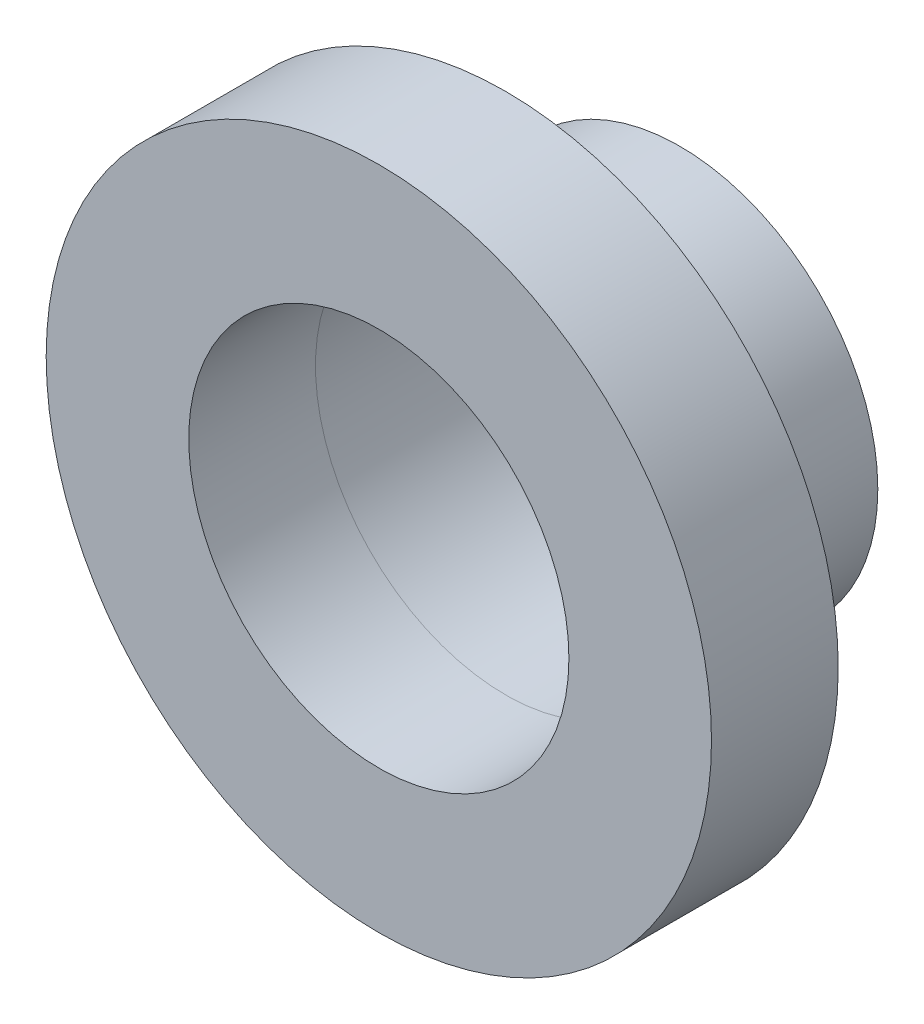
ISO-10303-21;
HEADER;
FILE_DESCRIPTION(('STEP AP214'),'2;1');
FILE_NAME('part.step','',(''),(''),'','','');
FILE_SCHEMA(('AUTOMOTIVE_DESIGN { 1 0 10303 214 1 1 1 1 }'));
ENDSEC;
DATA;
#1=APPLICATION_CONTEXT('core data for automotive mechanical design processes');
#2=APPLICATION_PROTOCOL_DEFINITION('international standard','automotive_design',2000,#1);
#3=PRODUCT_CONTEXT('',#1,'mechanical');
#4=PRODUCT('Part','Part','',(#3));
#5=PRODUCT_RELATED_PRODUCT_CATEGORY('part','',(#4));
#6=PRODUCT_DEFINITION_FORMATION('','',#4);
#7=PRODUCT_DEFINITION_CONTEXT('part definition',#1,'design');
#8=PRODUCT_DEFINITION('design','',#6,#7);
#9=PRODUCT_DEFINITION_SHAPE('','',#8);
#10=(LENGTH_UNIT() NAMED_UNIT(*) SI_UNIT(.MILLI.,.METRE.));
#11=(NAMED_UNIT(*) PLANE_ANGLE_UNIT() SI_UNIT($,.RADIAN.));
#12=(NAMED_UNIT(*) SI_UNIT($,.STERADIAN.) SOLID_ANGLE_UNIT());
#13=UNCERTAINTY_MEASURE_WITH_UNIT(LENGTH_MEASURE(1.E-05),#10,'distance_accuracy_value','');
#14=(GEOMETRIC_REPRESENTATION_CONTEXT(3) GLOBAL_UNCERTAINTY_ASSIGNED_CONTEXT((#13)) GLOBAL_UNIT_ASSIGNED_CONTEXT((#10,
#11,#12)) REPRESENTATION_CONTEXT('',''));
#15=CARTESIAN_POINT('',(0.,0.,0.));
#16=DIRECTION('',(0.,0.,1.));
#17=DIRECTION('',(1.,0.,0.));
#18=AXIS2_PLACEMENT_3D('',#15,#16,#17);
#19=CARTESIAN_POINT('',(0.,0.,19.));
#20=DIRECTION('',(0.,0.,1.));
#21=DIRECTION('',(1.,0.,0.));
#22=AXIS2_PLACEMENT_3D('',#19,#20,#21);
#23=PLANE('',#22);
#24=CARTESIAN_POINT('',(0.,0.,19.));
#25=DIRECTION('',(0.,0.,1.));
#26=DIRECTION('',(1.,0.,0.));
#27=AXIS2_PLACEMENT_3D('',#24,#25,#26);
#28=CIRCLE('',#27,21.);
#29=CARTESIAN_POINT('',(21.,0.,19.));
#30=VERTEX_POINT('',#29);
#31=EDGE_CURVE('E11',#30,#30,#28,.T.);
#32=ORIENTED_EDGE('',*,*,#31,.T.);
#33=EDGE_LOOP('',(#32));
#34=FACE_BOUND('',#33,.T.);
#35=CARTESIAN_POINT('',(0.,0.,19.));
#36=DIRECTION('',(0.,0.,1.));
#37=DIRECTION('',(1.,0.,0.));
#38=AXIS2_PLACEMENT_3D('',#35,#36,#37);
#39=CIRCLE('',#38,12.);
#40=CARTESIAN_POINT('',(12.,0.,19.));
#41=VERTEX_POINT('',#40);
#42=EDGE_CURVE('E50',#41,#41,#39,.T.);
#43=ORIENTED_EDGE('',*,*,#42,.F.);
#44=EDGE_LOOP('',(#43));
#45=FACE_BOUND('',#44,.T.);
#46=ADVANCED_FACE('F39',(#34,#45),#23,.T.);
#47=CARTESIAN_POINT('',(0.,0.,11.));
#48=DIRECTION('',(0.,0.,1.));
#49=DIRECTION('',(1.,0.,0.));
#50=AXIS2_PLACEMENT_3D('',#47,#48,#49);
#51=PLANE('',#50);
#52=CARTESIAN_POINT('',(0.,0.,11.));
#53=DIRECTION('',(0.,0.,1.));
#54=DIRECTION('',(1.,0.,0.));
#55=AXIS2_PLACEMENT_3D('',#52,#53,#54);
#56=CIRCLE('',#55,21.);
#57=CARTESIAN_POINT('',(21.,0.,11.));
#58=VERTEX_POINT('',#57);
#59=EDGE_CURVE('E43',#58,#58,#56,.T.);
#60=ORIENTED_EDGE('',*,*,#59,.F.);
#61=EDGE_LOOP('',(#60));
#62=FACE_BOUND('',#61,.T.);
#63=CARTESIAN_POINT('',(0.,0.,11.));
#64=DIRECTION('',(0.,0.,1.));
#65=DIRECTION('',(1.,0.,0.));
#66=AXIS2_PLACEMENT_3D('',#63,#64,#65);
#67=CIRCLE('',#66,12.);
#68=CARTESIAN_POINT('',(12.,0.,11.));
#69=VERTEX_POINT('',#68);
#70=EDGE_CURVE('E52',#69,#69,#67,.T.);
#71=ORIENTED_EDGE('',*,*,#70,.T.);
#72=EDGE_LOOP('',(#71));
#73=FACE_BOUND('',#72,.T.);
#74=ADVANCED_FACE('F62',(#62,#73),#51,.F.);
#75=CARTESIAN_POINT('',(0.,0.,19.));
#76=DIRECTION('',(0.,0.,-1.));
#77=DIRECTION('',(-1.,0.,0.));
#78=AXIS2_PLACEMENT_3D('',#75,#76,#77);
#79=CYLINDRICAL_SURFACE('',#78,21.);
#80=ORIENTED_EDGE('',*,*,#31,.F.);
#81=EDGE_LOOP('',(#80));
#82=FACE_BOUND('',#81,.T.);
#83=ORIENTED_EDGE('',*,*,#59,.T.);
#84=EDGE_LOOP('',(#83));
#85=FACE_BOUND('',#84,.T.);
#86=ADVANCED_FACE('F41',(#82,#85),#79,.T.);
#87=CARTESIAN_POINT('',(0.,0.,19.));
#88=DIRECTION('',(0.,0.,-1.));
#89=DIRECTION('',(-1.,0.,0.));
#90=AXIS2_PLACEMENT_3D('',#87,#88,#89);
#91=CYLINDRICAL_SURFACE('',#90,12.);
#92=ORIENTED_EDGE('',*,*,#42,.T.);
#93=EDGE_LOOP('',(#92));
#94=FACE_BOUND('',#93,.T.);
#95=ORIENTED_EDGE('',*,*,#70,.F.);
#96=EDGE_LOOP('',(#95));
#97=FACE_BOUND('',#96,.T.);
#98=ADVANCED_FACE('F58',(#94,#97),#91,.F.);
#99=CLOSED_SHELL('',(#46,#74,#86,#98));
#100=MANIFOLD_SOLID_BREP('B2',#99);
#101=CARTESIAN_POINT('',(0.,0.,11.));
#102=DIRECTION('',(0.,0.,1.));
#103=DIRECTION('',(1.,0.,0.));
#104=AXIS2_PLACEMENT_3D('',#101,#102,#103);
#105=PLANE('',#104);
#106=CARTESIAN_POINT('',(0.,0.,11.));
#107=DIRECTION('',(0.,0.,1.));
#108=DIRECTION('',(1.,0.,0.));
#109=AXIS2_PLACEMENT_3D('',#106,#107,#108);
#110=CIRCLE('',#109,12.5);
#111=CARTESIAN_POINT('',(12.5,0.,11.));
#112=VERTEX_POINT('',#111);
#113=EDGE_CURVE('E38',#112,#112,#110,.T.);
#114=ORIENTED_EDGE('',*,*,#113,.T.);
#115=EDGE_LOOP('',(#114));
#116=FACE_BOUND('',#115,.T.);
#117=CARTESIAN_POINT('',(0.,0.,11.));
#118=DIRECTION('',(0.,0.,1.));
#119=DIRECTION('',(1.,0.,0.));
#120=AXIS2_PLACEMENT_3D('',#117,#118,#119);
#121=CIRCLE('',#120,12.);
#122=CARTESIAN_POINT('',(12.,0.,11.));
#123=VERTEX_POINT('',#122);
#124=EDGE_CURVE('E112',#123,#123,#121,.T.);
#125=ORIENTED_EDGE('',*,*,#124,.F.);
#126=EDGE_LOOP('',(#125));
#127=FACE_BOUND('',#126,.T.);
#128=ADVANCED_FACE('F101',(#116,#127),#105,.T.);
#129=CARTESIAN_POINT('',(0.,0.,0.));
#130=DIRECTION('',(0.,0.,1.));
#131=DIRECTION('',(1.,0.,0.));
#132=AXIS2_PLACEMENT_3D('',#129,#130,#131);
#133=PLANE('',#132);
#134=CARTESIAN_POINT('',(0.,0.,0.));
#135=DIRECTION('',(0.,0.,1.));
#136=DIRECTION('',(1.,0.,0.));
#137=AXIS2_PLACEMENT_3D('',#134,#135,#136);
#138=CIRCLE('',#137,12.5);
#139=CARTESIAN_POINT('',(12.5,0.,0.));
#140=VERTEX_POINT('',#139);
#141=EDGE_CURVE('E105',#140,#140,#138,.T.);
#142=ORIENTED_EDGE('',*,*,#141,.F.);
#143=EDGE_LOOP('',(#142));
#144=FACE_BOUND('',#143,.T.);
#145=CARTESIAN_POINT('',(0.,0.,0.));
#146=DIRECTION('',(0.,0.,1.));
#147=DIRECTION('',(1.,0.,0.));
#148=AXIS2_PLACEMENT_3D('',#145,#146,#147);
#149=CIRCLE('',#148,12.);
#150=CARTESIAN_POINT('',(12.,0.,0.));
#151=VERTEX_POINT('',#150);
#152=EDGE_CURVE('E114',#151,#151,#149,.T.);
#153=ORIENTED_EDGE('',*,*,#152,.T.);
#154=EDGE_LOOP('',(#153));
#155=FACE_BOUND('',#154,.T.);
#156=ADVANCED_FACE('F124',(#144,#155),#133,.F.);
#157=CARTESIAN_POINT('',(0.,0.,11.));
#158=DIRECTION('',(0.,0.,-1.));
#159=DIRECTION('',(-1.,0.,0.));
#160=AXIS2_PLACEMENT_3D('',#157,#158,#159);
#161=CYLINDRICAL_SURFACE('',#160,12.5);
#162=ORIENTED_EDGE('',*,*,#113,.F.);
#163=EDGE_LOOP('',(#162));
#164=FACE_BOUND('',#163,.T.);
#165=ORIENTED_EDGE('',*,*,#141,.T.);
#166=EDGE_LOOP('',(#165));
#167=FACE_BOUND('',#166,.T.);
#168=ADVANCED_FACE('F103',(#164,#167),#161,.T.);
#169=CARTESIAN_POINT('',(0.,0.,11.));
#170=DIRECTION('',(0.,0.,-1.));
#171=DIRECTION('',(-1.,0.,0.));
#172=AXIS2_PLACEMENT_3D('',#169,#170,#171);
#173=CYLINDRICAL_SURFACE('',#172,12.);
#174=ORIENTED_EDGE('',*,*,#124,.T.);
#175=EDGE_LOOP('',(#174));
#176=FACE_BOUND('',#175,.T.);
#177=ORIENTED_EDGE('',*,*,#152,.F.);
#178=EDGE_LOOP('',(#177));
#179=FACE_BOUND('',#178,.T.);
#180=ADVANCED_FACE('F120',(#176,#179),#173,.F.);
#181=CLOSED_SHELL('',(#128,#156,#168,#180));
#182=MANIFOLD_SOLID_BREP('B6',#181);
#183=ADVANCED_BREP_SHAPE_REPRESENTATION('',(#18,#100,#182),#14);
#184=SHAPE_DEFINITION_REPRESENTATION(#9,#183);
ENDSEC;
END-ISO-10303-21;
